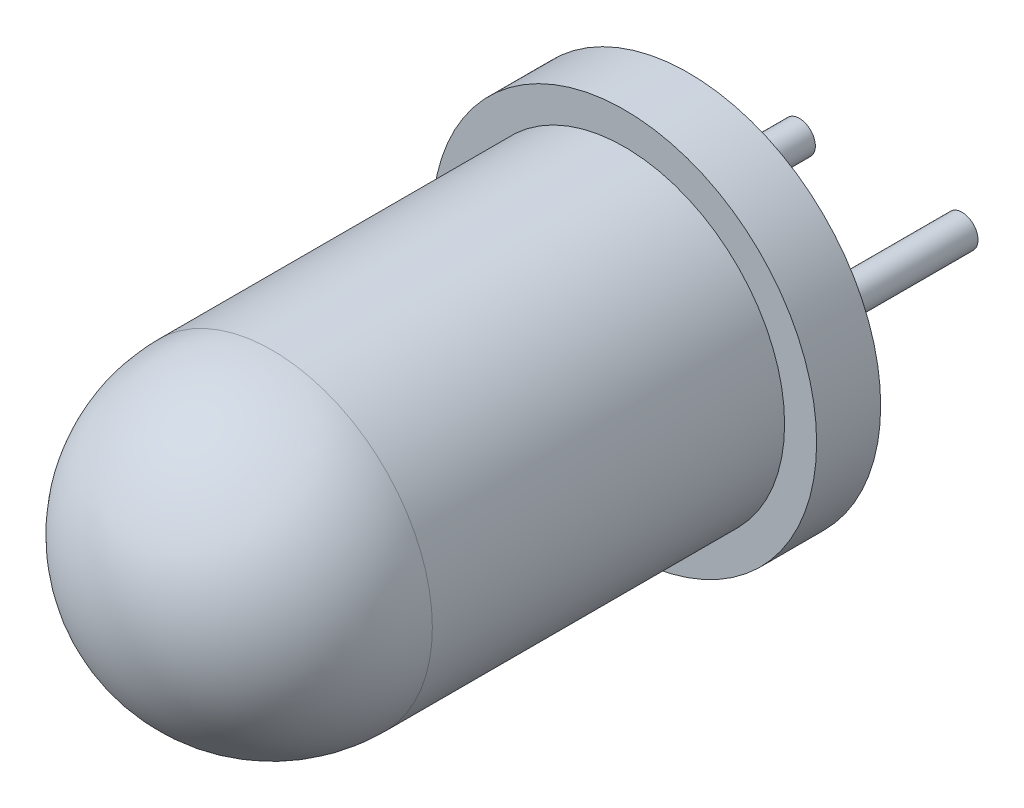
ISO-10303-21;
HEADER;
FILE_DESCRIPTION(('STEP AP214'),'2;1');
FILE_NAME('part.step','',(''),(''),'','','');
FILE_SCHEMA(('AUTOMOTIVE_DESIGN { 1 0 10303 214 1 1 1 1 }'));
ENDSEC;
DATA;
#1=APPLICATION_CONTEXT('core data for automotive mechanical design processes');
#2=APPLICATION_PROTOCOL_DEFINITION('international standard','automotive_design',2000,#1);
#3=PRODUCT_CONTEXT('',#1,'mechanical');
#4=PRODUCT('Part','Part','',(#3));
#5=PRODUCT_RELATED_PRODUCT_CATEGORY('part','',(#4));
#6=PRODUCT_DEFINITION_FORMATION('','',#4);
#7=PRODUCT_DEFINITION_CONTEXT('part definition',#1,'design');
#8=PRODUCT_DEFINITION('design','',#6,#7);
#9=PRODUCT_DEFINITION_SHAPE('','',#8);
#10=(LENGTH_UNIT() NAMED_UNIT(*) SI_UNIT(.MILLI.,.METRE.));
#11=(NAMED_UNIT(*) PLANE_ANGLE_UNIT() SI_UNIT($,.RADIAN.));
#12=(NAMED_UNIT(*) SI_UNIT($,.STERADIAN.) SOLID_ANGLE_UNIT());
#13=UNCERTAINTY_MEASURE_WITH_UNIT(LENGTH_MEASURE(1.E-05),#10,'distance_accuracy_value','');
#14=(GEOMETRIC_REPRESENTATION_CONTEXT(3) GLOBAL_UNCERTAINTY_ASSIGNED_CONTEXT((#13)) GLOBAL_UNIT_ASSIGNED_CONTEXT((#10,
#11,#12)) REPRESENTATION_CONTEXT('',''));
#15=CARTESIAN_POINT('',(0.,0.,0.));
#16=DIRECTION('',(0.,0.,1.));
#17=DIRECTION('',(1.,0.,0.));
#18=AXIS2_PLACEMENT_3D('',#15,#16,#17);
#19=CARTESIAN_POINT('',(-100.662182305842,-109.682408721429,5.00000000000056));
#20=DIRECTION('',(0.,0.,-1.));
#21=DIRECTION('',(-1.,0.,0.));
#22=AXIS2_PLACEMENT_3D('',#19,#20,#21);
#23=PLANE('',#22);
#24=CARTESIAN_POINT('',(-100.662182305842,-109.682408721429,5.00000000000056));
#25=DIRECTION('',(0.,0.,-1.));
#26=DIRECTION('',(-1.,0.,0.));
#27=AXIS2_PLACEMENT_3D('',#24,#25,#26);
#28=CIRCLE('',#27,0.25);
#29=CARTESIAN_POINT('',(-100.912182305842,-109.682408721429,5.00000000000056));
#30=VERTEX_POINT('',#29);
#31=EDGE_CURVE('E20',#30,#30,#28,.F.);
#32=ORIENTED_EDGE('',*,*,#31,.F.);
#33=EDGE_LOOP('',(#32));
#34=FACE_BOUND('',#33,.T.);
#35=ADVANCED_FACE('F17',(#34),#23,.T.);
#36=CARTESIAN_POINT('',(-98.1221823058425,-109.682408721429,5.00000000000056));
#37=DIRECTION('',(0.,0.,1.));
#38=DIRECTION('',(1.,0.,0.));
#39=AXIS2_PLACEMENT_3D('',#36,#37,#38);
#40=PLANE('',#39);
#41=CARTESIAN_POINT('',(-98.1221823058425,-109.682408721429,5.00000000000056));
#42=DIRECTION('',(0.,0.,-1.));
#43=DIRECTION('',(-1.,0.,0.));
#44=AXIS2_PLACEMENT_3D('',#41,#42,#43);
#45=CIRCLE('',#44,0.25);
#46=CARTESIAN_POINT('',(-98.3721823058425,-109.682408721429,5.00000000000056));
#47=VERTEX_POINT('',#46);
#48=EDGE_CURVE('E55',#47,#47,#45,.F.);
#49=ORIENTED_EDGE('',*,*,#48,.F.);
#50=EDGE_LOOP('',(#49));
#51=FACE_BOUND('',#50,.T.);
#52=ADVANCED_FACE('F66',(#51),#40,.F.);
#53=CARTESIAN_POINT('',(-100.662182305842,-109.682408721429,5.00000000000056));
#54=DIRECTION('',(0.,0.,-1.));
#55=DIRECTION('',(-1.,0.,0.));
#56=AXIS2_PLACEMENT_3D('',#53,#54,#55);
#57=CYLINDRICAL_SURFACE('',#56,0.25);
#58=ORIENTED_EDGE('',*,*,#31,.T.);
#59=EDGE_LOOP('',(#58));
#60=FACE_BOUND('',#59,.T.);
#61=CARTESIAN_POINT('',(-100.662182305842,-109.682408721429,8.00000000000056));
#62=DIRECTION('',(0.,0.,-1.));
#63=DIRECTION('',(-1.,0.,0.));
#64=AXIS2_PLACEMENT_3D('',#61,#62,#63);
#65=CIRCLE('',#64,0.25);
#66=CARTESIAN_POINT('',(-100.912182305842,-109.682408721429,8.00000000000056));
#67=VERTEX_POINT('',#66);
#68=EDGE_CURVE('E53',#67,#67,#65,.T.);
#69=ORIENTED_EDGE('',*,*,#68,.T.);
#70=EDGE_LOOP('',(#69));
#71=FACE_BOUND('',#70,.T.);
#72=ADVANCED_FACE('F62',(#60,#71),#57,.T.);
#73=CARTESIAN_POINT('',(-98.1221823058425,-109.682408721429,5.00000000000056));
#74=DIRECTION('',(0.,0.,-1.));
#75=DIRECTION('',(-1.,0.,0.));
#76=AXIS2_PLACEMENT_3D('',#73,#74,#75);
#77=CYLINDRICAL_SURFACE('',#76,0.25);
#78=ORIENTED_EDGE('',*,*,#48,.T.);
#79=EDGE_LOOP('',(#78));
#80=FACE_BOUND('',#79,.T.);
#81=CARTESIAN_POINT('',(-98.1221823058425,-109.682408721429,8.00000000000056));
#82=DIRECTION('',(0.,0.,-1.));
#83=DIRECTION('',(-1.,0.,0.));
#84=AXIS2_PLACEMENT_3D('',#81,#82,#83);
#85=CIRCLE('',#84,0.25);
#86=CARTESIAN_POINT('',(-98.3721823058425,-109.682408721429,8.00000000000056));
#87=VERTEX_POINT('',#86);
#88=EDGE_CURVE('E50',#87,#87,#85,.T.);
#89=ORIENTED_EDGE('',*,*,#88,.T.);
#90=EDGE_LOOP('',(#89));
#91=FACE_BOUND('',#90,.T.);
#92=ADVANCED_FACE('F93',(#80,#91),#77,.T.);
#93=CARTESIAN_POINT('',(-99.3921823058425,-109.682408721429,8.00000000000056));
#94=DIRECTION('',(0.,0.,1.));
#95=DIRECTION('',(1.,0.,0.));
#96=AXIS2_PLACEMENT_3D('',#93,#94,#95);
#97=PLANE('',#96);
#98=ORIENTED_EDGE('',*,*,#88,.F.);
#99=EDGE_LOOP('',(#98));
#100=FACE_BOUND('',#99,.T.);
#101=ORIENTED_EDGE('',*,*,#68,.F.);
#102=EDGE_LOOP('',(#101));
#103=FACE_BOUND('',#102,.T.);
#104=CARTESIAN_POINT('',(-99.3921823058425,-109.682408721429,8.00000000000056));
#105=DIRECTION('',(0.,0.,1.));
#106=DIRECTION('',(1.,0.,0.));
#107=AXIS2_PLACEMENT_3D('',#104,#105,#106);
#108=CIRCLE('',#107,3.);
#109=CARTESIAN_POINT('',(-96.3921823058425,-109.682408721429,8.00000000000056));
#110=VERTEX_POINT('',#109);
#111=EDGE_CURVE('E41',#110,#110,#108,.T.);
#112=ORIENTED_EDGE('',*,*,#111,.F.);
#113=EDGE_LOOP('',(#112));
#114=FACE_BOUND('',#113,.T.);
#115=ADVANCED_FACE('F89',(#100,#103,#114),#97,.F.);
#116=CARTESIAN_POINT('',(-99.3921823058425,-109.682408721429,9.00000000000056));
#117=DIRECTION('',(0.,0.,1.));
#118=DIRECTION('',(1.,0.,0.));
#119=AXIS2_PLACEMENT_3D('',#116,#117,#118);
#120=CYLINDRICAL_SURFACE('',#119,3.);
#121=ORIENTED_EDGE('',*,*,#111,.T.);
#122=EDGE_LOOP('',(#121));
#123=FACE_BOUND('',#122,.T.);
#124=CARTESIAN_POINT('',(-99.3921823058425,-109.682408721429,9.00000000000056));
#125=DIRECTION('',(0.,0.,1.));
#126=DIRECTION('',(1.,0.,0.));
#127=AXIS2_PLACEMENT_3D('',#124,#125,#126);
#128=CIRCLE('',#127,3.);
#129=CARTESIAN_POINT('',(-96.3921823058425,-109.682408721429,9.00000000000056));
#130=VERTEX_POINT('',#129);
#131=EDGE_CURVE('E38',#130,#130,#128,.T.);
#132=ORIENTED_EDGE('',*,*,#131,.F.);
#133=EDGE_LOOP('',(#132));
#134=FACE_BOUND('',#133,.T.);
#135=ADVANCED_FACE('F85',(#123,#134),#120,.T.);
#136=CARTESIAN_POINT('',(-99.3921823058425,-109.682408721429,14.5000000000006));
#137=DIRECTION('',(1.,0.,0.));
#138=DIRECTION('',(0.,0.,-1.));
#139=AXIS2_PLACEMENT_3D('',#136,#137,#138);
#140=SPHERICAL_SURFACE('',#139,2.5);
#141=CARTESIAN_POINT('',(-99.3921823058425,-109.682408721429,14.5000000000006));
#142=DIRECTION('',(0.,0.,1.));
#143=DIRECTION('',(1.,0.,0.));
#144=AXIS2_PLACEMENT_3D('',#141,#142,#143);
#145=CIRCLE('',#144,2.5);
#146=CARTESIAN_POINT('',(-101.892182305842,-109.682408721429,14.5000000000006));
#147=VERTEX_POINT('',#146);
#148=CARTESIAN_POINT('',(-96.8921823058425,-109.682408721429,14.5000000000006));
#149=VERTEX_POINT('',#148);
#150=EDGE_CURVE('E26',#147,#149,#145,.F.);
#151=ORIENTED_EDGE('',*,*,#150,.F.);
#152=CARTESIAN_POINT('',(-99.3921823058425,-109.682408721429,14.5000000000006));
#153=DIRECTION('',(0.,0.,1.));
#154=DIRECTION('',(1.,0.,0.));
#155=AXIS2_PLACEMENT_3D('',#152,#153,#154);
#156=CIRCLE('',#155,2.5);
#157=EDGE_CURVE('E32',#149,#147,#156,.F.);
#158=ORIENTED_EDGE('',*,*,#157,.F.);
#159=EDGE_LOOP('',(#151,#158));
#160=FACE_BOUND('',#159,.T.);
#161=ADVANCED_FACE('F34',(#160),#140,.T.);
#162=CARTESIAN_POINT('',(-99.3921823058425,-109.682408721429,9.00000000000056));
#163=DIRECTION('',(0.,0.,1.));
#164=DIRECTION('',(1.,0.,0.));
#165=AXIS2_PLACEMENT_3D('',#162,#163,#164);
#166=PLANE('',#165);
#167=CARTESIAN_POINT('',(-99.3921823058425,-109.682408721429,9.00000000000056));
#168=DIRECTION('',(0.,0.,1.));
#169=DIRECTION('',(1.,0.,0.));
#170=AXIS2_PLACEMENT_3D('',#167,#168,#169);
#171=CIRCLE('',#170,2.5);
#172=CARTESIAN_POINT('',(-96.8921823058425,-109.682408721429,9.00000000000056));
#173=VERTEX_POINT('',#172);
#174=EDGE_CURVE('E11',#173,#173,#171,.T.);
#175=ORIENTED_EDGE('',*,*,#174,.F.);
#176=EDGE_LOOP('',(#175));
#177=FACE_BOUND('',#176,.T.);
#178=ORIENTED_EDGE('',*,*,#131,.T.);
#179=EDGE_LOOP('',(#178));
#180=FACE_BOUND('',#179,.T.);
#181=ADVANCED_FACE('F73',(#177,#180),#166,.T.);
#182=CARTESIAN_POINT('',(-99.3921823058425,-109.682408721429,17.0000000000006));
#183=DIRECTION('',(0.,0.,1.));
#184=DIRECTION('',(1.,0.,0.));
#185=AXIS2_PLACEMENT_3D('',#182,#183,#184);
#186=CYLINDRICAL_SURFACE('',#185,2.5);
#187=ORIENTED_EDGE('',*,*,#174,.T.);
#188=EDGE_LOOP('',(#187));
#189=FACE_BOUND('',#188,.T.);
#190=ORIENTED_EDGE('',*,*,#150,.T.);
#191=ORIENTED_EDGE('',*,*,#157,.T.);
#192=EDGE_LOOP('',(#190,#191));
#193=FACE_BOUND('',#192,.T.);
#194=ADVANCED_FACE('F37',(#189,#193),#186,.T.);
#195=CLOSED_SHELL('',(#35,#52,#72,#92,#115,#135,#161,#181,#194));
#196=MANIFOLD_SOLID_BREP('B1',#195);
#197=ADVANCED_BREP_SHAPE_REPRESENTATION('',(#18,#196),#14);
#198=SHAPE_DEFINITION_REPRESENTATION(#9,#197);
ENDSEC;
END-ISO-10303-21;
